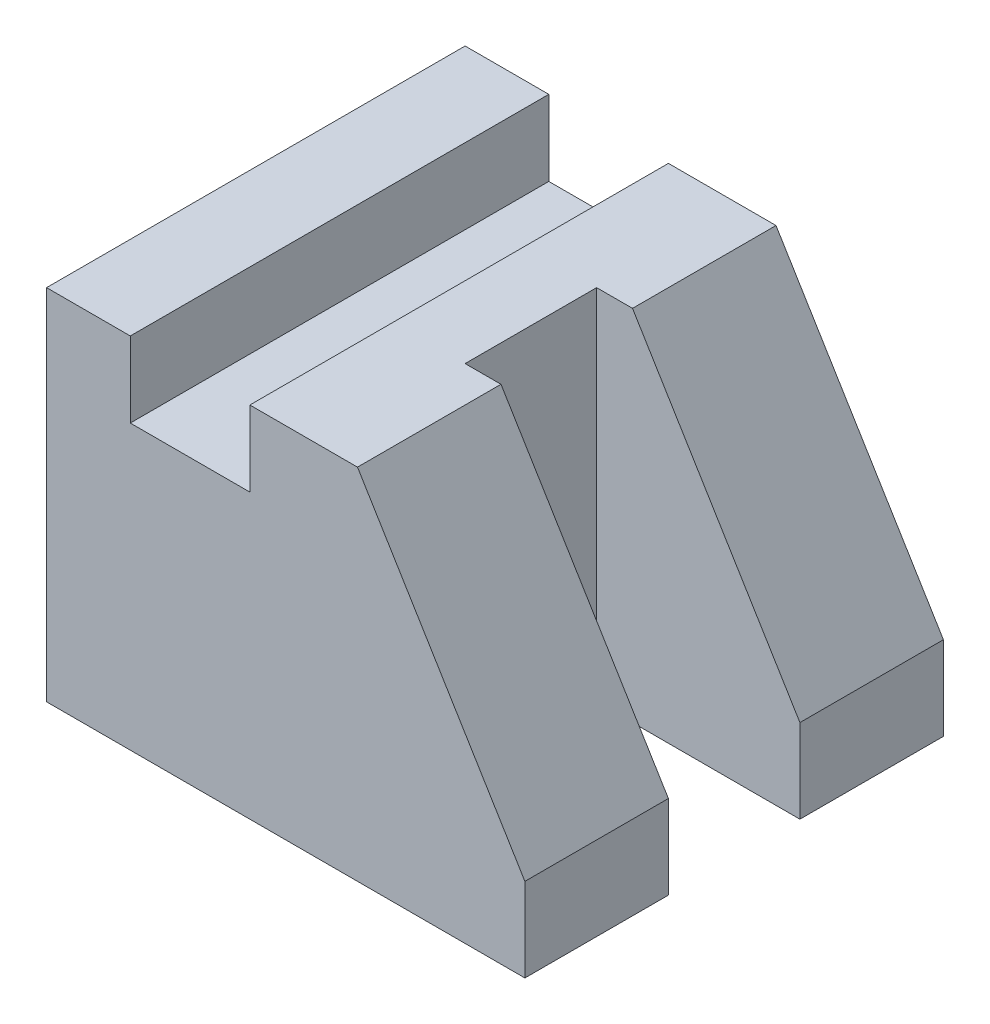
ISO-10303-21;
HEADER;
FILE_DESCRIPTION(('STEP AP214'),'2;1');
FILE_NAME('part.step','',(''),(''),'','','');
FILE_SCHEMA(('AUTOMOTIVE_DESIGN { 1 0 10303 214 1 1 1 1 }'));
ENDSEC;
DATA;
#1=APPLICATION_CONTEXT('core data for automotive mechanical design processes');
#2=APPLICATION_PROTOCOL_DEFINITION('international standard','automotive_design',2000,#1);
#3=PRODUCT_CONTEXT('',#1,'mechanical');
#4=PRODUCT('Part','Part','',(#3));
#5=PRODUCT_RELATED_PRODUCT_CATEGORY('part','',(#4));
#6=PRODUCT_DEFINITION_FORMATION('','',#4);
#7=PRODUCT_DEFINITION_CONTEXT('part definition',#1,'design');
#8=PRODUCT_DEFINITION('design','',#6,#7);
#9=PRODUCT_DEFINITION_SHAPE('','',#8);
#10=(LENGTH_UNIT() NAMED_UNIT(*) SI_UNIT(.MILLI.,.METRE.));
#11=(NAMED_UNIT(*) PLANE_ANGLE_UNIT() SI_UNIT($,.RADIAN.));
#12=(NAMED_UNIT(*) SI_UNIT($,.STERADIAN.) SOLID_ANGLE_UNIT());
#13=UNCERTAINTY_MEASURE_WITH_UNIT(LENGTH_MEASURE(1.E-05),#10,'distance_accuracy_value','');
#14=(GEOMETRIC_REPRESENTATION_CONTEXT(3) GLOBAL_UNCERTAINTY_ASSIGNED_CONTEXT((#13)) GLOBAL_UNIT_ASSIGNED_CONTEXT((#10,
#11,#12)) REPRESENTATION_CONTEXT('',''));
#15=CARTESIAN_POINT('',(0.,0.,0.));
#16=DIRECTION('',(0.,0.,1.));
#17=DIRECTION('',(1.,0.,0.));
#18=AXIS2_PLACEMENT_3D('',#15,#16,#17);
#19=CARTESIAN_POINT('',(-441.569230769231,-560.753846153846,1778.));
#20=DIRECTION('',(-1.,0.,0.));
#21=DIRECTION('',(0.,0.,1.));
#22=AXIS2_PLACEMENT_3D('',#19,#20,#21);
#23=PLANE('',#22);
#24=DIRECTION('',(0.,0.,-1.));
#25=VECTOR('',#24,1.);
#26=CARTESIAN_POINT('',(-441.569230769231,-205.153846153846,1778.));
#27=LINE('',#26,#25);
#28=CARTESIAN_POINT('',(-441.569230769231,-205.153846153846,609.6));
#29=VERTEX_POINT('',#28);
#30=CARTESIAN_POINT('',(-441.569230769231,-205.153846153846,0.));
#31=VERTEX_POINT('',#30);
#32=EDGE_CURVE('E207',#29,#31,#27,.T.);
#33=ORIENTED_EDGE('',*,*,#32,.F.);
#34=DIRECTION('',(0.,-1.,0.));
#35=VECTOR('',#34,1.);
#36=CARTESIAN_POINT('',(-441.569230769231,-560.753846153846,609.6));
#37=LINE('',#36,#35);
#38=CARTESIAN_POINT('',(-441.569230769231,-560.753846153846,609.6));
#39=VERTEX_POINT('',#38);
#40=EDGE_CURVE('E274',#29,#39,#37,.T.);
#41=ORIENTED_EDGE('',*,*,#40,.T.);
#42=DIRECTION('',(0.,0.,-1.));
#43=VECTOR('',#42,1.);
#44=CARTESIAN_POINT('',(-441.569230769231,-560.753846153846,1778.));
#45=LINE('',#44,#43);
#46=CARTESIAN_POINT('',(-441.569230769231,-560.753846153846,0.));
#47=VERTEX_POINT('',#46);
#48=EDGE_CURVE('E212',#39,#47,#45,.T.);
#49=ORIENTED_EDGE('',*,*,#48,.T.);
#50=DIRECTION('',(0.,1.,0.));
#51=VECTOR('',#50,1.);
#52=CARTESIAN_POINT('',(-441.569230769231,-560.753846153846,0.));
#53=LINE('',#52,#51);
#54=EDGE_CURVE('E177',#47,#31,#53,.T.);
#55=ORIENTED_EDGE('',*,*,#54,.T.);
#56=EDGE_LOOP('',(#33,#41,#49,#55));
#57=FACE_BOUND('',#56,.T.);
#58=ADVANCED_FACE('F45',(#57),#23,.F.);
#59=CARTESIAN_POINT('',(-441.569230769231,-205.153846153846,1778.));
#60=DIRECTION('',(-0.854198555614439,-0.519946946895745,0.));
#61=DIRECTION('',(0.519946946895745,-0.854198555614439,0.));
#62=AXIS2_PLACEMENT_3D('',#59,#60,#61);
#63=PLANE('',#62);
#64=DIRECTION('',(0.,0.,-1.));
#65=VECTOR('',#64,1.);
#66=CARTESIAN_POINT('',(-1152.76923076923,963.246153846154,1778.));
#67=LINE('',#66,#65);
#68=CARTESIAN_POINT('',(-1152.76923076923,963.246153846154,609.6));
#69=VERTEX_POINT('',#68);
#70=CARTESIAN_POINT('',(-1152.76923076923,963.246153846154,0.));
#71=VERTEX_POINT('',#70);
#72=EDGE_CURVE('E202',#69,#71,#67,.T.);
#73=ORIENTED_EDGE('',*,*,#72,.F.);
#74=DIRECTION('',(0.519946946895745,-0.854198555614439,0.));
#75=VECTOR('',#74,1.);
#76=CARTESIAN_POINT('',(-441.569230769231,-205.153846153846,609.6));
#77=LINE('',#76,#75);
#78=EDGE_CURVE('E278',#69,#29,#77,.T.);
#79=ORIENTED_EDGE('',*,*,#78,.T.);
#80=ORIENTED_EDGE('',*,*,#32,.T.);
#81=DIRECTION('',(-0.519946946895745,0.854198555614438,0.));
#82=VECTOR('',#81,1.);
#83=CARTESIAN_POINT('',(-441.569230769231,-205.153846153846,0.));
#84=LINE('',#83,#82);
#85=EDGE_CURVE('E181',#31,#71,#84,.T.);
#86=ORIENTED_EDGE('',*,*,#85,.T.);
#87=EDGE_LOOP('',(#73,#79,#80,#86));
#88=FACE_BOUND('',#87,.T.);
#89=ADVANCED_FACE('F335',(#88),#63,.F.);
#90=CARTESIAN_POINT('',(-2117.96923076923,963.246153846154,1778.));
#91=DIRECTION('',(0.,-1.,0.));
#92=DIRECTION('',(0.,0.,-1.));
#93=AXIS2_PLACEMENT_3D('',#90,#91,#92);
#94=PLANE('',#93);
#95=DIRECTION('',(-1.,0.,0.));
#96=VECTOR('',#95,1.);
#97=CARTESIAN_POINT('',(-2117.96923076923,963.246153846154,0.));
#98=LINE('',#97,#96);
#99=CARTESIAN_POINT('',(-2117.96923076923,963.246153846154,0.));
#100=VERTEX_POINT('',#99);
#101=CARTESIAN_POINT('',(-2473.56923076923,963.246153846154,0.));
#102=VERTEX_POINT('',#101);
#103=EDGE_CURVE('E165',#100,#102,#98,.T.);
#104=ORIENTED_EDGE('',*,*,#103,.T.);
#105=DIRECTION('',(0.,0.,-1.));
#106=VECTOR('',#105,1.);
#107=CARTESIAN_POINT('',(-2473.56923076923,963.246153846154,1778.));
#108=LINE('',#107,#106);
#109=CARTESIAN_POINT('',(-2473.56923076923,963.246153846154,1778.));
#110=VERTEX_POINT('',#109);
#111=EDGE_CURVE('E54',#110,#102,#108,.T.);
#112=ORIENTED_EDGE('',*,*,#111,.F.);
#113=DIRECTION('',(-1.,0.,0.));
#114=VECTOR('',#113,1.);
#115=CARTESIAN_POINT('',(-2117.96923076923,963.246153846154,1778.));
#116=LINE('',#115,#114);
#117=CARTESIAN_POINT('',(-2117.96923076923,963.246153846154,1778.));
#118=VERTEX_POINT('',#117);
#119=EDGE_CURVE('E195',#118,#110,#116,.T.);
#120=ORIENTED_EDGE('',*,*,#119,.F.);
#121=DIRECTION('',(0.,0.,-1.));
#122=VECTOR('',#121,1.);
#123=CARTESIAN_POINT('',(-2117.96923076923,963.246153846154,1778.));
#124=LINE('',#123,#122);
#125=EDGE_CURVE('E161',#118,#100,#124,.T.);
#126=ORIENTED_EDGE('',*,*,#125,.T.);
#127=EDGE_LOOP('',(#104,#112,#120,#126));
#128=FACE_BOUND('',#127,.T.);
#129=ADVANCED_FACE('F47',(#128),#94,.F.);
#130=CARTESIAN_POINT('',(-2473.56923076923,963.246153846154,1778.));
#131=DIRECTION('',(1.,0.,0.));
#132=DIRECTION('',(0.,0.,-1.));
#133=AXIS2_PLACEMENT_3D('',#130,#131,#132);
#134=PLANE('',#133);
#135=DIRECTION('',(0.,-1.,0.));
#136=VECTOR('',#135,1.);
#137=CARTESIAN_POINT('',(-2473.56923076923,963.246153846154,0.));
#138=LINE('',#137,#136);
#139=CARTESIAN_POINT('',(-2473.56923076923,-560.753846153846,0.));
#140=VERTEX_POINT('',#139);
#141=EDGE_CURVE('E169',#102,#140,#138,.T.);
#142=ORIENTED_EDGE('',*,*,#141,.T.);
#143=DIRECTION('',(0.,0.,-1.));
#144=VECTOR('',#143,1.);
#145=CARTESIAN_POINT('',(-2473.56923076923,-560.753846153846,1778.));
#146=LINE('',#145,#144);
#147=CARTESIAN_POINT('',(-2473.56923076923,-560.753846153846,1778.));
#148=VERTEX_POINT('',#147);
#149=EDGE_CURVE('E217',#148,#140,#146,.T.);
#150=ORIENTED_EDGE('',*,*,#149,.F.);
#151=DIRECTION('',(0.,-1.,0.));
#152=VECTOR('',#151,1.);
#153=CARTESIAN_POINT('',(-2473.56923076923,963.246153846154,1778.));
#154=LINE('',#153,#152);
#155=EDGE_CURVE('E115',#110,#148,#154,.T.);
#156=ORIENTED_EDGE('',*,*,#155,.F.);
#157=ORIENTED_EDGE('',*,*,#111,.T.);
#158=EDGE_LOOP('',(#142,#150,#156,#157));
#159=FACE_BOUND('',#158,.T.);
#160=ADVANCED_FACE('F222',(#159),#134,.F.);
#161=CARTESIAN_POINT('',(-2473.56923076923,-560.753846153846,1778.));
#162=DIRECTION('',(0.,1.,0.));
#163=DIRECTION('',(0.,0.,1.));
#164=AXIS2_PLACEMENT_3D('',#161,#162,#163);
#165=PLANE('',#164);
#166=ORIENTED_EDGE('',*,*,#48,.F.);
#167=DIRECTION('',(-1.,0.,0.));
#168=VECTOR('',#167,1.);
#169=CARTESIAN_POINT('',(-2473.56923076923,-560.753846153846,609.6));
#170=LINE('',#169,#168);
#171=CARTESIAN_POINT('',(-1305.16923076923,-560.753846153846,609.6));
#172=VERTEX_POINT('',#171);
#173=EDGE_CURVE('E271',#39,#172,#170,.T.);
#174=ORIENTED_EDGE('',*,*,#173,.T.);
#175=DIRECTION('',(0.,0.,1.));
#176=VECTOR('',#175,1.);
#177=CARTESIAN_POINT('',(-1305.16923076923,-560.753846153846,1778.));
#178=LINE('',#177,#176);
#179=CARTESIAN_POINT('',(-1305.16923076923,-560.753846153846,1168.4));
#180=VERTEX_POINT('',#179);
#181=EDGE_CURVE('E170',#172,#180,#178,.T.);
#182=ORIENTED_EDGE('',*,*,#181,.T.);
#183=DIRECTION('',(1.,0.,0.));
#184=VECTOR('',#183,1.);
#185=CARTESIAN_POINT('',(-2473.56923076923,-560.753846153846,1168.4));
#186=LINE('',#185,#184);
#187=CARTESIAN_POINT('',(-441.569230769231,-560.753846153846,1168.4));
#188=VERTEX_POINT('',#187);
#189=EDGE_CURVE('E282',#180,#188,#186,.T.);
#190=ORIENTED_EDGE('',*,*,#189,.T.);
#191=CARTESIAN_POINT('',(-441.569230769231,-560.753846153846,1778.));
#192=VERTEX_POINT('',#191);
#193=EDGE_CURVE('E213',#192,#188,#45,.T.);
#194=ORIENTED_EDGE('',*,*,#193,.F.);
#195=DIRECTION('',(1.,0.,0.));
#196=VECTOR('',#195,1.);
#197=CARTESIAN_POINT('',(-2473.56923076923,-560.753846153846,1778.));
#198=LINE('',#197,#196);
#199=EDGE_CURVE('E237',#148,#192,#198,.T.);
#200=ORIENTED_EDGE('',*,*,#199,.F.);
#201=ORIENTED_EDGE('',*,*,#149,.T.);
#202=DIRECTION('',(1.,0.,0.));
#203=VECTOR('',#202,1.);
#204=CARTESIAN_POINT('',(-2473.56923076923,-560.753846153846,0.));
#205=LINE('',#204,#203);
#206=EDGE_CURVE('E173',#140,#47,#205,.T.);
#207=ORIENTED_EDGE('',*,*,#206,.T.);
#208=EDGE_LOOP('',(#166,#174,#182,#190,#194,#200,#201,#207));
#209=FACE_BOUND('',#208,.T.);
#210=ADVANCED_FACE('F233',(#209),#165,.F.);
#211=ORIENTED_EDGE('',*,*,#193,.T.);
#212=DIRECTION('',(0.,1.,0.));
#213=VECTOR('',#212,1.);
#214=CARTESIAN_POINT('',(-441.569230769231,-560.753846153846,1168.4));
#215=LINE('',#214,#213);
#216=CARTESIAN_POINT('',(-441.569230769231,-205.153846153846,1168.4));
#217=VERTEX_POINT('',#216);
#218=EDGE_CURVE('E285',#188,#217,#215,.T.);
#219=ORIENTED_EDGE('',*,*,#218,.T.);
#220=CARTESIAN_POINT('',(-441.569230769231,-205.153846153846,1778.));
#221=VERTEX_POINT('',#220);
#222=EDGE_CURVE('E208',#221,#217,#27,.T.);
#223=ORIENTED_EDGE('',*,*,#222,.F.);
#224=DIRECTION('',(0.,1.,0.));
#225=VECTOR('',#224,1.);
#226=CARTESIAN_POINT('',(-441.569230769231,-560.753846153846,1778.));
#227=LINE('',#226,#225);
#228=EDGE_CURVE('E241',#192,#221,#227,.T.);
#229=ORIENTED_EDGE('',*,*,#228,.F.);
#230=EDGE_LOOP('',(#211,#219,#223,#229));
#231=FACE_BOUND('',#230,.T.);
#232=ADVANCED_FACE('F344',(#231),#23,.F.);
#233=ORIENTED_EDGE('',*,*,#222,.T.);
#234=DIRECTION('',(-0.519946946895745,0.854198555614439,0.));
#235=VECTOR('',#234,1.);
#236=CARTESIAN_POINT('',(-441.569230769231,-205.153846153846,1168.4));
#237=LINE('',#236,#235);
#238=CARTESIAN_POINT('',(-1152.76923076923,963.246153846154,1168.4));
#239=VERTEX_POINT('',#238);
#240=EDGE_CURVE('E260',#217,#239,#237,.T.);
#241=ORIENTED_EDGE('',*,*,#240,.T.);
#242=CARTESIAN_POINT('',(-1152.76923076923,963.246153846154,1778.));
#243=VERTEX_POINT('',#242);
#244=EDGE_CURVE('E203',#243,#239,#67,.T.);
#245=ORIENTED_EDGE('',*,*,#244,.F.);
#246=DIRECTION('',(-0.519946946895745,0.854198555614438,0.));
#247=VECTOR('',#246,1.);
#248=CARTESIAN_POINT('',(-441.569230769231,-205.153846153846,1778.));
#249=LINE('',#248,#247);
#250=EDGE_CURVE('E245',#221,#243,#249,.T.);
#251=ORIENTED_EDGE('',*,*,#250,.F.);
#252=EDGE_LOOP('',(#233,#241,#245,#251));
#253=FACE_BOUND('',#252,.T.);
#254=ADVANCED_FACE('F257',(#253),#63,.F.);
#255=CARTESIAN_POINT('',(-1152.76923076923,963.246153846154,1778.));
#256=DIRECTION('',(0.,-1.,0.));
#257=DIRECTION('',(1.,0.,0.));
#258=AXIS2_PLACEMENT_3D('',#255,#256,#257);
#259=PLANE('',#258);
#260=DIRECTION('',(0.,0.,1.));
#261=VECTOR('',#260,1.);
#262=CARTESIAN_POINT('',(-1305.16923076923,963.246153846154,609.6));
#263=LINE('',#262,#261);
#264=CARTESIAN_POINT('',(-1305.16923076923,963.246153846154,609.6));
#265=VERTEX_POINT('',#264);
#266=CARTESIAN_POINT('',(-1305.16923076923,963.246153846154,1168.4));
#267=VERTEX_POINT('',#266);
#268=EDGE_CURVE('E61',#265,#267,#263,.T.);
#269=ORIENTED_EDGE('',*,*,#268,.F.);
#270=DIRECTION('',(1.,0.,0.));
#271=VECTOR('',#270,1.);
#272=CARTESIAN_POINT('',(-1152.76923076923,963.246153846154,609.6));
#273=LINE('',#272,#271);
#274=EDGE_CURVE('E11',#265,#69,#273,.T.);
#275=ORIENTED_EDGE('',*,*,#274,.T.);
#276=ORIENTED_EDGE('',*,*,#72,.T.);
#277=DIRECTION('',(-1.,0.,0.));
#278=VECTOR('',#277,1.);
#279=CARTESIAN_POINT('',(-1152.76923076923,963.246153846154,0.));
#280=LINE('',#279,#278);
#281=CARTESIAN_POINT('',(-1609.96923076923,963.246153846154,0.));
#282=VERTEX_POINT('',#281);
#283=EDGE_CURVE('E185',#71,#282,#280,.T.);
#284=ORIENTED_EDGE('',*,*,#283,.T.);
#285=DIRECTION('',(0.,0.,-1.));
#286=VECTOR('',#285,1.);
#287=CARTESIAN_POINT('',(-1609.96923076923,963.246153846154,1778.));
#288=LINE('',#287,#286);
#289=CARTESIAN_POINT('',(-1609.96923076923,963.246153846154,1778.));
#290=VERTEX_POINT('',#289);
#291=EDGE_CURVE('E154',#290,#282,#288,.T.);
#292=ORIENTED_EDGE('',*,*,#291,.F.);
#293=DIRECTION('',(-1.,0.,0.));
#294=VECTOR('',#293,1.);
#295=CARTESIAN_POINT('',(-1152.76923076923,963.246153846154,1778.));
#296=LINE('',#295,#294);
#297=EDGE_CURVE('E140',#243,#290,#296,.T.);
#298=ORIENTED_EDGE('',*,*,#297,.F.);
#299=ORIENTED_EDGE('',*,*,#244,.T.);
#300=DIRECTION('',(1.,0.,0.));
#301=VECTOR('',#300,1.);
#302=CARTESIAN_POINT('',(-1305.16923076923,963.246153846154,1168.4));
#303=LINE('',#302,#301);
#304=EDGE_CURVE('E295',#267,#239,#303,.T.);
#305=ORIENTED_EDGE('',*,*,#304,.F.);
#306=EDGE_LOOP('',(#269,#275,#276,#284,#292,#298,#299,#305));
#307=FACE_BOUND('',#306,.T.);
#308=ADVANCED_FACE('F263',(#307),#259,.F.);
#309=CARTESIAN_POINT('',(-1609.96923076923,963.246153846154,1778.));
#310=DIRECTION('',(1.,0.,0.));
#311=DIRECTION('',(0.,1.,0.));
#312=AXIS2_PLACEMENT_3D('',#309,#310,#311);
#313=PLANE('',#312);
#314=DIRECTION('',(0.,-1.,0.));
#315=VECTOR('',#314,1.);
#316=CARTESIAN_POINT('',(-1609.96923076923,963.246153846154,0.));
#317=LINE('',#316,#315);
#318=CARTESIAN_POINT('',(-1609.96923076923,642.815384615385,0.));
#319=VERTEX_POINT('',#318);
#320=EDGE_CURVE('E150',#282,#319,#317,.T.);
#321=ORIENTED_EDGE('',*,*,#320,.T.);
#322=DIRECTION('',(0.,0.,-1.));
#323=VECTOR('',#322,1.);
#324=CARTESIAN_POINT('',(-1609.96923076923,642.815384615385,1778.));
#325=LINE('',#324,#323);
#326=CARTESIAN_POINT('',(-1609.96923076923,642.815384615385,1778.));
#327=VERTEX_POINT('',#326);
#328=EDGE_CURVE('E147',#327,#319,#325,.T.);
#329=ORIENTED_EDGE('',*,*,#328,.F.);
#330=DIRECTION('',(0.,-1.,0.));
#331=VECTOR('',#330,1.);
#332=CARTESIAN_POINT('',(-1609.96923076923,963.246153846154,1778.));
#333=LINE('',#332,#331);
#334=EDGE_CURVE('E133',#290,#327,#333,.T.);
#335=ORIENTED_EDGE('',*,*,#334,.F.);
#336=ORIENTED_EDGE('',*,*,#291,.T.);
#337=EDGE_LOOP('',(#321,#329,#335,#336));
#338=FACE_BOUND('',#337,.T.);
#339=ADVANCED_FACE('F148',(#338),#313,.F.);
#340=CARTESIAN_POINT('',(-1609.96923076923,642.815384615385,1778.));
#341=DIRECTION('',(0.,-1.,0.));
#342=DIRECTION('',(1.,0.,0.));
#343=AXIS2_PLACEMENT_3D('',#340,#341,#342);
#344=PLANE('',#343);
#345=DIRECTION('',(-1.,0.,0.));
#346=VECTOR('',#345,1.);
#347=CARTESIAN_POINT('',(-1609.96923076923,642.815384615385,0.));
#348=LINE('',#347,#346);
#349=CARTESIAN_POINT('',(-2117.96923076923,642.815384615385,0.));
#350=VERTEX_POINT('',#349);
#351=EDGE_CURVE('E190',#319,#350,#348,.T.);
#352=ORIENTED_EDGE('',*,*,#351,.T.);
#353=DIRECTION('',(0.,0.,-1.));
#354=VECTOR('',#353,1.);
#355=CARTESIAN_POINT('',(-2117.96923076923,642.815384615385,1778.));
#356=LINE('',#355,#354);
#357=CARTESIAN_POINT('',(-2117.96923076923,642.815384615385,1778.));
#358=VERTEX_POINT('',#357);
#359=EDGE_CURVE('E155',#358,#350,#356,.T.);
#360=ORIENTED_EDGE('',*,*,#359,.F.);
#361=DIRECTION('',(-1.,0.,0.));
#362=VECTOR('',#361,1.);
#363=CARTESIAN_POINT('',(-1609.96923076923,642.815384615385,1778.));
#364=LINE('',#363,#362);
#365=EDGE_CURVE('E137',#327,#358,#364,.T.);
#366=ORIENTED_EDGE('',*,*,#365,.F.);
#367=ORIENTED_EDGE('',*,*,#328,.T.);
#368=EDGE_LOOP('',(#352,#360,#366,#367));
#369=FACE_BOUND('',#368,.T.);
#370=ADVANCED_FACE('F157',(#369),#344,.F.);
#371=CARTESIAN_POINT('',(-2117.96923076923,642.815384615385,1778.));
#372=DIRECTION('',(-1.,0.,0.));
#373=DIRECTION('',(0.,0.,1.));
#374=AXIS2_PLACEMENT_3D('',#371,#372,#373);
#375=PLANE('',#374);
#376=DIRECTION('',(0.,1.,0.));
#377=VECTOR('',#376,1.);
#378=CARTESIAN_POINT('',(-2117.96923076923,642.815384615385,0.));
#379=LINE('',#378,#377);
#380=EDGE_CURVE('E106',#350,#100,#379,.T.);
#381=ORIENTED_EDGE('',*,*,#380,.T.);
#382=ORIENTED_EDGE('',*,*,#125,.F.);
#383=DIRECTION('',(0.,1.,0.));
#384=VECTOR('',#383,1.);
#385=CARTESIAN_POINT('',(-2117.96923076923,642.815384615385,1778.));
#386=LINE('',#385,#384);
#387=EDGE_CURVE('E70',#358,#118,#386,.T.);
#388=ORIENTED_EDGE('',*,*,#387,.F.);
#389=ORIENTED_EDGE('',*,*,#359,.T.);
#390=EDGE_LOOP('',(#381,#382,#388,#389));
#391=FACE_BOUND('',#390,.T.);
#392=ADVANCED_FACE('F265',(#391),#375,.F.);
#393=CARTESIAN_POINT('',(0.,0.,1778.));
#394=DIRECTION('',(0.,0.,1.));
#395=DIRECTION('',(1.,0.,0.));
#396=AXIS2_PLACEMENT_3D('',#393,#394,#395);
#397=PLANE('',#396);
#398=ORIENTED_EDGE('',*,*,#119,.T.);
#399=ORIENTED_EDGE('',*,*,#155,.T.);
#400=ORIENTED_EDGE('',*,*,#199,.T.);
#401=ORIENTED_EDGE('',*,*,#228,.T.);
#402=ORIENTED_EDGE('',*,*,#250,.T.);
#403=ORIENTED_EDGE('',*,*,#297,.T.);
#404=ORIENTED_EDGE('',*,*,#334,.T.);
#405=ORIENTED_EDGE('',*,*,#365,.T.);
#406=ORIENTED_EDGE('',*,*,#387,.T.);
#407=EDGE_LOOP('',(#398,#399,#400,#401,#402,#403,#404,#405,#406));
#408=FACE_BOUND('',#407,.T.);
#409=ADVANCED_FACE('F135',(#408),#397,.T.);
#410=CARTESIAN_POINT('',(0.,0.,0.));
#411=DIRECTION('',(0.,0.,1.));
#412=DIRECTION('',(1.,0.,0.));
#413=AXIS2_PLACEMENT_3D('',#410,#411,#412);
#414=PLANE('',#413);
#415=ORIENTED_EDGE('',*,*,#103,.F.);
#416=ORIENTED_EDGE('',*,*,#380,.F.);
#417=ORIENTED_EDGE('',*,*,#351,.F.);
#418=ORIENTED_EDGE('',*,*,#320,.F.);
#419=ORIENTED_EDGE('',*,*,#283,.F.);
#420=ORIENTED_EDGE('',*,*,#85,.F.);
#421=ORIENTED_EDGE('',*,*,#54,.F.);
#422=ORIENTED_EDGE('',*,*,#206,.F.);
#423=ORIENTED_EDGE('',*,*,#141,.F.);
#424=EDGE_LOOP('',(#415,#416,#417,#418,#419,#420,#421,#422,#423));
#425=FACE_BOUND('',#424,.T.);
#426=ADVANCED_FACE('F227',(#425),#414,.F.);
#427=CARTESIAN_POINT('',(-1305.16923076923,-814.753846153846,609.6));
#428=DIRECTION('',(-1.,0.,0.));
#429=DIRECTION('',(0.,0.,1.));
#430=AXIS2_PLACEMENT_3D('',#427,#428,#429);
#431=PLANE('',#430);
#432=DIRECTION('',(0.,1.,0.));
#433=VECTOR('',#432,1.);
#434=CARTESIAN_POINT('',(-1305.16923076923,-814.753846153846,609.6));
#435=LINE('',#434,#433);
#436=EDGE_CURVE('E291',#172,#265,#435,.T.);
#437=ORIENTED_EDGE('',*,*,#436,.T.);
#438=ORIENTED_EDGE('',*,*,#268,.T.);
#439=DIRECTION('',(0.,1.,0.));
#440=VECTOR('',#439,1.);
#441=CARTESIAN_POINT('',(-1305.16923076923,-814.753846153846,1168.4));
#442=LINE('',#441,#440);
#443=EDGE_CURVE('E292',#180,#267,#442,.T.);
#444=ORIENTED_EDGE('',*,*,#443,.F.);
#445=ORIENTED_EDGE('',*,*,#181,.F.);
#446=EDGE_LOOP('',(#437,#438,#444,#445));
#447=FACE_BOUND('',#446,.T.);
#448=ADVANCED_FACE('F396',(#447),#431,.F.);
#449=CARTESIAN_POINT('',(-1305.16923076923,-814.753846153846,609.6));
#450=DIRECTION('',(0.,0.,-1.));
#451=DIRECTION('',(-1.,0.,0.));
#452=AXIS2_PLACEMENT_3D('',#449,#450,#451);
#453=PLANE('',#452);
#454=ORIENTED_EDGE('',*,*,#40,.F.);
#455=ORIENTED_EDGE('',*,*,#78,.F.);
#456=ORIENTED_EDGE('',*,*,#274,.F.);
#457=ORIENTED_EDGE('',*,*,#436,.F.);
#458=ORIENTED_EDGE('',*,*,#173,.F.);
#459=EDGE_LOOP('',(#454,#455,#456,#457,#458));
#460=FACE_BOUND('',#459,.T.);
#461=ADVANCED_FACE('F328',(#460),#453,.F.);
#462=CARTESIAN_POINT('',(-1305.16923076923,-814.753846153846,1168.4));
#463=DIRECTION('',(0.,0.,1.));
#464=DIRECTION('',(1.,0.,0.));
#465=AXIS2_PLACEMENT_3D('',#462,#463,#464);
#466=PLANE('',#465);
#467=ORIENTED_EDGE('',*,*,#443,.T.);
#468=ORIENTED_EDGE('',*,*,#304,.T.);
#469=ORIENTED_EDGE('',*,*,#240,.F.);
#470=ORIENTED_EDGE('',*,*,#218,.F.);
#471=ORIENTED_EDGE('',*,*,#189,.F.);
#472=EDGE_LOOP('',(#467,#468,#469,#470,#471));
#473=FACE_BOUND('',#472,.T.);
#474=ADVANCED_FACE('F303',(#473),#466,.F.);
#475=CLOSED_SHELL('',(#58,#89,#129,#160,#210,#232,#254,#308,#339,#370,#392,#409,#426,#448,#461,#474));
#476=MANIFOLD_SOLID_BREP('B2',#475);
#477=ADVANCED_BREP_SHAPE_REPRESENTATION('',(#18,#476),#14);
#478=SHAPE_DEFINITION_REPRESENTATION(#9,#477);
ENDSEC;
END-ISO-10303-21;
